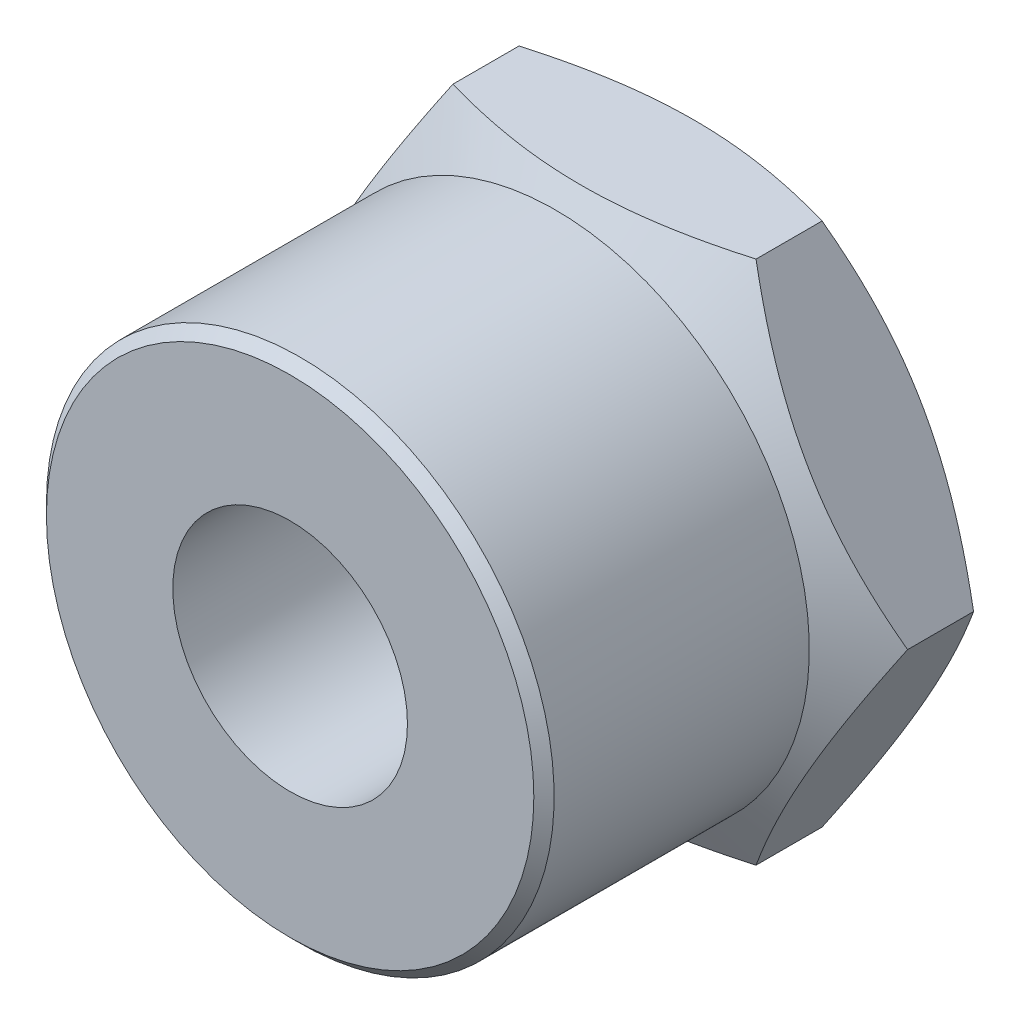
ISO-10303-21;
HEADER;
FILE_DESCRIPTION(('STEP AP214'),'2;1');
FILE_NAME('part.step','',(''),(''),'','','');
FILE_SCHEMA(('AUTOMOTIVE_DESIGN { 1 0 10303 214 1 1 1 1 }'));
ENDSEC;
DATA;
#1=APPLICATION_CONTEXT('core data for automotive mechanical design processes');
#2=APPLICATION_PROTOCOL_DEFINITION('international standard','automotive_design',2000,#1);
#3=PRODUCT_CONTEXT('',#1,'mechanical');
#4=PRODUCT('Part','Part','',(#3));
#5=PRODUCT_RELATED_PRODUCT_CATEGORY('part','',(#4));
#6=PRODUCT_DEFINITION_FORMATION('','',#4);
#7=PRODUCT_DEFINITION_CONTEXT('part definition',#1,'design');
#8=PRODUCT_DEFINITION('design','',#6,#7);
#9=PRODUCT_DEFINITION_SHAPE('','',#8);
#10=(LENGTH_UNIT() NAMED_UNIT(*) SI_UNIT(.MILLI.,.METRE.));
#11=(NAMED_UNIT(*) PLANE_ANGLE_UNIT() SI_UNIT($,.RADIAN.));
#12=(NAMED_UNIT(*) SI_UNIT($,.STERADIAN.) SOLID_ANGLE_UNIT());
#13=UNCERTAINTY_MEASURE_WITH_UNIT(LENGTH_MEASURE(1.E-05),#10,'distance_accuracy_value','');
#14=(GEOMETRIC_REPRESENTATION_CONTEXT(3) GLOBAL_UNCERTAINTY_ASSIGNED_CONTEXT((#13)) GLOBAL_UNIT_ASSIGNED_CONTEXT((#10,
#11,#12)) REPRESENTATION_CONTEXT('',''));
#15=CARTESIAN_POINT('',(0.,0.,0.));
#16=DIRECTION('',(0.,0.,1.));
#17=DIRECTION('',(1.,0.,0.));
#18=AXIS2_PLACEMENT_3D('',#15,#16,#17);
#19=CARTESIAN_POINT('',(1.58771324027147,-2.75,-1.72));
#20=DIRECTION('',(0.,0.,1.));
#21=DIRECTION('',(1.,0.,0.));
#22=AXIS2_PLACEMENT_3D('',#19,#20,#21);
#23=PLANE('',#22);
#24=CARTESIAN_POINT('',(0.,0.,-1.72));
#25=DIRECTION('',(0.,0.,-1.));
#26=DIRECTION('',(-1.,0.,0.));
#27=AXIS2_PLACEMENT_3D('',#24,#25,#26);
#28=CIRCLE('',#27,2.285);
#29=CARTESIAN_POINT('',(-2.285,0.,-1.72));
#30=VERTEX_POINT('',#29);
#31=EDGE_CURVE('E260',#30,#30,#28,.T.);
#32=ORIENTED_EDGE('',*,*,#31,.T.);
#33=EDGE_LOOP('',(#32));
#34=FACE_BOUND('',#33,.T.);
#35=CARTESIAN_POINT('',(0.,0.,-1.72));
#36=DIRECTION('',(0.,0.,-1.));
#37=DIRECTION('',(-1.,0.,0.));
#38=AXIS2_PLACEMENT_3D('',#35,#36,#37);
#39=CIRCLE('',#38,1.725);
#40=CARTESIAN_POINT('',(-1.725,0.,-1.72));
#41=VERTEX_POINT('',#40);
#42=EDGE_CURVE('E273',#41,#41,#39,.T.);
#43=ORIENTED_EDGE('',*,*,#42,.F.);
#44=EDGE_LOOP('',(#43));
#45=FACE_BOUND('',#44,.T.);
#46=ADVANCED_FACE('F37',(#34,#45),#23,.F.);
#47=CARTESIAN_POINT('',(0.,0.,-1.72));
#48=DIRECTION('',(0.,0.,1.));
#49=DIRECTION('',(1.,0.,0.));
#50=AXIS2_PLACEMENT_3D('',#47,#48,#49);
#51=CYLINDRICAL_SURFACE('',#50,1.2295);
#52=CARTESIAN_POINT('',(0.,0.,2.78));
#53=DIRECTION('',(0.,0.,1.));
#54=DIRECTION('',(1.,0.,0.));
#55=AXIS2_PLACEMENT_3D('',#52,#53,#54);
#56=CIRCLE('',#55,1.2295);
#57=CARTESIAN_POINT('',(1.2295,0.,2.78));
#58=VERTEX_POINT('',#57);
#59=EDGE_CURVE('E269',#58,#58,#56,.T.);
#60=ORIENTED_EDGE('',*,*,#59,.T.);
#61=EDGE_LOOP('',(#60));
#62=FACE_BOUND('',#61,.T.);
#63=CARTESIAN_POINT('',(0.,0.,-1.2245));
#64=DIRECTION('',(0.,0.,-1.));
#65=DIRECTION('',(-1.,0.,0.));
#66=AXIS2_PLACEMENT_3D('',#63,#64,#65);
#67=CIRCLE('',#66,1.2295);
#68=CARTESIAN_POINT('',(-1.2295,0.,-1.2245));
#69=VERTEX_POINT('',#68);
#70=EDGE_CURVE('E277',#69,#69,#67,.T.);
#71=ORIENTED_EDGE('',*,*,#70,.T.);
#72=EDGE_LOOP('',(#71));
#73=FACE_BOUND('',#72,.T.);
#74=ADVANCED_FACE('F142',(#62,#73),#51,.F.);
#75=CARTESIAN_POINT('',(-1.58771324027147,-2.75,-1.72));
#76=DIRECTION('',(0.,-1.,0.));
#77=DIRECTION('',(0.,0.,-1.));
#78=AXIS2_PLACEMENT_3D('',#75,#76,#77);
#79=PLANE('',#78);
#80=DIRECTION('',(0.,0.,1.));
#81=VECTOR('',#80,1.);
#82=CARTESIAN_POINT('',(1.58771324027147,-2.75,-1.72));
#83=LINE('',#82,#81);
#84=CARTESIAN_POINT('',(1.58771324027147,-2.75,-1.20591203176497));
#85=VERTEX_POINT('',#84);
#86=CARTESIAN_POINT('',(1.58771324027147,-2.75,-0.51408796823503));
#87=VERTEX_POINT('',#86);
#88=EDGE_CURVE('E123',#85,#87,#83,.T.);
#89=ORIENTED_EDGE('',*,*,#88,.T.);
#90=CARTESIAN_POINT('',(-4.17372684406499,-2.75,-1.56649519663326));
#91=CARTESIAN_POINT('',(-4.0543385393001,-2.75,-1.50895353087764));
#92=CARTESIAN_POINT('',(-3.93466614233989,-2.75,-1.45199067335123));
#93=CARTESIAN_POINT('',(-3.69460168800773,-2.75,-1.33955013709002));
#94=CARTESIAN_POINT('',(-3.57420951182439,-2.75,-1.2840727123215));
#95=CARTESIAN_POINT('',(-3.33188887394322,-2.75,-1.17463169777906));
#96=CARTESIAN_POINT('',(-3.20995554626624,-2.75,-1.12067884287359));
#97=CARTESIAN_POINT('',(-2.9650864516681,-2.75,-1.01510676567586));
#98=CARTESIAN_POINT('',(-2.84215073537795,-2.75,-0.963487426368249));
#99=CARTESIAN_POINT('',(-2.59150373483061,-2.75,-0.861749515549482));
#100=CARTESIAN_POINT('',(-2.46375713082373,-2.75,-0.811717461971101));
#101=CARTESIAN_POINT('',(-2.20673616561206,-2.75,-0.71566537092324));
#102=CARTESIAN_POINT('',(-2.07746163024061,-2.75,-0.669645795937771));
#103=CARTESIAN_POINT('',(-1.81745207460588,-2.75,-0.582893873341714));
#104=CARTESIAN_POINT('',(-1.6867209461336,-2.75,-0.542149983927988));
#105=CARTESIAN_POINT('',(-1.42338681719978,-2.75,-0.467316261676878));
#106=CARTESIAN_POINT('',(-1.29078444965124,-2.75,-0.433224234193583));
#107=CARTESIAN_POINT('',(-1.02433887064421,-2.75,-0.373561773278668));
#108=CARTESIAN_POINT('',(-0.890505221596048,-2.75,-0.347949446844723));
#109=CARTESIAN_POINT('',(-0.621273907465344,-2.75,-0.306758679336462));
#110=CARTESIAN_POINT('',(-0.485876362902075,-2.75,-0.291179470257582));
#111=CARTESIAN_POINT('',(-0.215921601291206,-2.75,-0.271502351990315));
#112=CARTESIAN_POINT('',(-0.0813748696181582,-2.75,-0.267264088732277));
#113=CARTESIAN_POINT('',(0.187599110045629,-2.75,-0.270263841263952));
#114=CARTESIAN_POINT('',(0.322026353083202,-2.75,-0.277502312457631));
#115=CARTESIAN_POINT('',(0.553032973989187,-2.75,-0.299305978692785));
#116=CARTESIAN_POINT('',(0.649866681902796,-2.75,-0.311312750750877));
#117=CARTESIAN_POINT('',(0.842761762143801,-2.75,-0.340482204376346));
#118=CARTESIAN_POINT('',(0.938823015235661,-2.75,-0.357645666815055));
#119=CARTESIAN_POINT('',(1.22574286825352,-2.75,-0.415964698210105));
#120=CARTESIAN_POINT('',(1.41521785730979,-2.75,-0.463936189477523));
#121=CARTESIAN_POINT('',(1.79428512096762,-2.75,-0.574115481863774));
#122=CARTESIAN_POINT('',(1.9837910889686,-2.75,-0.63660906585339));
#123=CARTESIAN_POINT('',(2.26544227808109,-2.75,-0.737399034746913));
#124=CARTESIAN_POINT('',(2.35887921292864,-2.75,-0.772165566470393));
#125=CARTESIAN_POINT('',(2.54499425117055,-2.75,-0.843673848490346));
#126=CARTESIAN_POINT('',(2.6376723618397,-2.75,-0.880415579825145));
#127=CARTESIAN_POINT('',(2.84931342346716,-2.75,-0.966501314174346));
#128=CARTESIAN_POINT('',(2.96805271430832,-2.75,-1.01639347447517));
#129=CARTESIAN_POINT('',(3.20459307067893,-2.75,-1.11835913672541));
#130=CARTESIAN_POINT('',(3.32239409339951,-2.75,-1.17043273753309));
#131=CARTESIAN_POINT('',(3.67465780532789,-2.75,-1.32927418148282));
#132=CARTESIAN_POINT('',(3.90794437704778,-2.75,-1.43864738128381));
#133=CARTESIAN_POINT('',(4.3724940002385,-2.75,-1.66207379455617));
#134=CARTESIAN_POINT('',(4.60375510751267,-2.75,-1.77613101008109));
#135=CARTESIAN_POINT('',(5.06467949382113,-2.75,-2.00743991307571));
#136=CARTESIAN_POINT('',(5.29434272202688,-2.75,-2.12469170158681));
#137=CARTESIAN_POINT('',(5.73454063268933,-2.75,-2.35220461856083));
#138=CARTESIAN_POINT('',(5.94516444342971,-2.75,-2.46229385483603));
#139=CARTESIAN_POINT('',(6.36564330009182,-2.75,-2.68394378312386));
#140=CARTESIAN_POINT('',(6.57549832375427,-2.75,-2.7955045173183));
#141=CARTESIAN_POINT('',(6.99415533064721,-2.75,-3.01951487842416));
#142=CARTESIAN_POINT('',(7.20295860617876,-2.75,-3.13196209355304));
#143=CARTESIAN_POINT('',(7.62006981796338,-2.75,-3.35774838003791));
#144=CARTESIAN_POINT('',(7.82837777721637,-2.75,-3.47108740888633));
#145=CARTESIAN_POINT('',(8.03650140351037,-2.75,-3.58476166346595));
#146=B_SPLINE_CURVE_WITH_KNOTS('',3,(#90,#91,#92,#93,#94,#95,#96,#97,#98,#99,#100,#101,#102,
#103,#104,#105,#106,#107,#108,#109,#110,#111,#112,#113,#114,#115,#116,#117,#118,#119,#120,#121,
#122,#123,#124,#125,#126,#127,#128,#129,#130,#131,#132,#133,#134,#135,#136,#137,#138,#139,#140,
#141,#142,#143,#144,#145),.UNSPECIFIED.,.F.,.F.,(4,2,2,2,2,2,2,2,2,2,2,2,2,2,2,2,2,2,2,2,2,2,2,
2,2,2,2,4),(0.,0.397599966461047,0.795267482546577,1.19525774136748,1.59522792017056,
2.00676015839095,2.41833976787196,2.82900316344548,3.23953083906245,3.64799898410124,
4.05643585843049,4.45979407402056,4.8631682955163,5.15575145410835,5.44837894056086,
6.03399339336628,6.63228890740999,6.9313576813945,7.23042358486796,7.61678155833849,
8.0031570597176,8.77602744416118,9.54957250280418,10.3231420564341,11.0361137043264,
11.7491058348068,12.4605728673644,13.1720061913926),.UNSPECIFIED.);
#147=CARTESIAN_POINT('',(-1.58771324027147,-2.75,-0.51408796823503));
#148=VERTEX_POINT('',#147);
#149=EDGE_CURVE('E52',#87,#148,#146,.F.);
#150=ORIENTED_EDGE('',*,*,#149,.T.);
#151=DIRECTION('',(0.,0.,1.));
#152=VECTOR('',#151,1.);
#153=CARTESIAN_POINT('',(-1.58771324027147,-2.75,-1.72));
#154=LINE('',#153,#152);
#155=CARTESIAN_POINT('',(-1.58771324027147,-2.75,-1.20591203176497));
#156=VERTEX_POINT('',#155);
#157=EDGE_CURVE('E106',#156,#148,#154,.T.);
#158=ORIENTED_EDGE('',*,*,#157,.F.);
#159=CARTESIAN_POINT('',(-4.17372684406499,-2.75,-0.153504803366739));
#160=CARTESIAN_POINT('',(-4.05433853930011,-2.75,-0.21104646912236));
#161=CARTESIAN_POINT('',(-3.93466614233989,-2.75,-0.268009326648769));
#162=CARTESIAN_POINT('',(-3.69460168800773,-2.75,-0.380449862909983));
#163=CARTESIAN_POINT('',(-3.57420951182439,-2.75,-0.435927287678496));
#164=CARTESIAN_POINT('',(-3.33188887394321,-2.75,-0.545368302220938));
#165=CARTESIAN_POINT('',(-3.20995554626624,-2.75,-0.599321157126408));
#166=CARTESIAN_POINT('',(-2.9650864516681,-2.75,-0.704893234324142));
#167=CARTESIAN_POINT('',(-2.84215073537795,-2.75,-0.75651257363175));
#168=CARTESIAN_POINT('',(-2.59150373483061,-2.75,-0.858250484450517));
#169=CARTESIAN_POINT('',(-2.46375713082373,-2.75,-0.908282538028898));
#170=CARTESIAN_POINT('',(-2.20673616561206,-2.75,-1.00433462907676));
#171=CARTESIAN_POINT('',(-2.07746163024061,-2.75,-1.05035420406223));
#172=CARTESIAN_POINT('',(-1.81745207460588,-2.75,-1.13710612665828));
#173=CARTESIAN_POINT('',(-1.6867209461336,-2.75,-1.17785001607201));
#174=CARTESIAN_POINT('',(-1.42338681719978,-2.75,-1.25268373832312));
#175=CARTESIAN_POINT('',(-1.29078444965124,-2.75,-1.28677576580642));
#176=CARTESIAN_POINT('',(-1.02433887064421,-2.75,-1.34643822672133));
#177=CARTESIAN_POINT('',(-0.890505221596048,-2.75,-1.37205055315528));
#178=CARTESIAN_POINT('',(-0.621273907465344,-2.75,-1.41324132066354));
#179=CARTESIAN_POINT('',(-0.485876362902075,-2.75,-1.42882052974242));
#180=CARTESIAN_POINT('',(-0.215921601291206,-2.75,-1.44849764800968));
#181=CARTESIAN_POINT('',(-0.0813748696181581,-2.75,-1.45273591126772));
#182=CARTESIAN_POINT('',(0.187599110045629,-2.75,-1.44973615873605));
#183=CARTESIAN_POINT('',(0.322026353083202,-2.75,-1.44249768754237));
#184=CARTESIAN_POINT('',(0.553032973989188,-2.75,-1.42069402130721));
#185=CARTESIAN_POINT('',(0.649866681902797,-2.75,-1.40868724924912));
#186=CARTESIAN_POINT('',(0.842761762143801,-2.75,-1.37951779562365));
#187=CARTESIAN_POINT('',(0.938823015235661,-2.75,-1.36235433318494));
#188=CARTESIAN_POINT('',(1.22574286825352,-2.75,-1.30403530178989));
#189=CARTESIAN_POINT('',(1.4152178573098,-2.75,-1.25606381052248));
#190=CARTESIAN_POINT('',(1.79428512096762,-2.75,-1.14588451813622));
#191=CARTESIAN_POINT('',(1.9837910889686,-2.75,-1.08339093414661));
#192=CARTESIAN_POINT('',(2.2654422780811,-2.75,-0.982600965253086));
#193=CARTESIAN_POINT('',(2.35887921292864,-2.75,-0.947834433529606));
#194=CARTESIAN_POINT('',(2.54499425117055,-2.75,-0.876326151509653));
#195=CARTESIAN_POINT('',(2.6376723618397,-2.75,-0.839584420174854));
#196=CARTESIAN_POINT('',(2.84931342346716,-2.75,-0.753498685825653));
#197=CARTESIAN_POINT('',(2.96805271430832,-2.75,-0.703606525524828));
#198=CARTESIAN_POINT('',(3.20459307067893,-2.75,-0.601640863274594));
#199=CARTESIAN_POINT('',(3.32239409339951,-2.75,-0.549567262466908));
#200=CARTESIAN_POINT('',(3.67465780532789,-2.75,-0.390725818517179));
#201=CARTESIAN_POINT('',(3.90794437704778,-2.75,-0.281352618716188));
#202=CARTESIAN_POINT('',(4.3724940002385,-2.75,-0.0579262054438312));
#203=CARTESIAN_POINT('',(4.60375510751267,-2.75,0.0561310100810888));
#204=CARTESIAN_POINT('',(5.06467949382113,-2.75,0.287439913075707));
#205=CARTESIAN_POINT('',(5.29434272202688,-2.75,0.40469170158681));
#206=CARTESIAN_POINT('',(5.73454063268933,-2.75,0.632204618560831));
#207=CARTESIAN_POINT('',(5.94516444342971,-2.75,0.742293854836033));
#208=CARTESIAN_POINT('',(6.36564330009182,-2.75,0.963943783123857));
#209=CARTESIAN_POINT('',(6.57549832375427,-2.75,1.0755045173183));
#210=CARTESIAN_POINT('',(6.99415533064721,-2.75,1.29951487842416));
#211=CARTESIAN_POINT('',(7.20295860617876,-2.75,1.41196209355304));
#212=CARTESIAN_POINT('',(7.62006981796339,-2.75,1.63774838003791));
#213=CARTESIAN_POINT('',(7.82837777721637,-2.75,1.75108740888633));
#214=CARTESIAN_POINT('',(8.03650140351038,-2.75,1.86476166346595));
#215=B_SPLINE_CURVE_WITH_KNOTS('',3,(#159,#160,#161,#162,#163,#164,#165,#166,#167,#168,#169,
#170,#171,#172,#173,#174,#175,#176,#177,#178,#179,#180,#181,#182,#183,#184,#185,#186,#187,#188,
#189,#190,#191,#192,#193,#194,#195,#196,#197,#198,#199,#200,#201,#202,#203,#204,#205,#206,#207,
#208,#209,#210,#211,#212,#213,#214),.UNSPECIFIED.,.F.,.F.,(4,2,2,2,2,2,2,2,2,2,2,2,2,2,2,2,2,2,
2,2,2,2,2,2,2,2,2,4),(0.,0.397599966461048,0.795267482546577,1.19525774136748,1.59522792017056,
2.00676015839095,2.41833976787196,2.82900316344548,3.23953083906245,3.64799898410124,
4.05643585843049,4.45979407402056,4.8631682955163,5.15575145410835,5.44837894056086,
6.03399339336628,6.63228890740999,6.9313576813945,7.23042358486796,7.61678155833849,
8.0031570597176,8.77602744416118,9.54957250280418,10.3231420564341,11.0361137043264,
11.7491058348068,12.4605728673644,13.1720061913927),.UNSPECIFIED.);
#216=EDGE_CURVE('E125',#156,#85,#215,.T.);
#217=ORIENTED_EDGE('',*,*,#216,.T.);
#218=EDGE_LOOP('',(#89,#150,#158,#217));
#219=FACE_BOUND('',#218,.T.);
#220=ADVANCED_FACE('F148',(#219),#79,.T.);
#221=CARTESIAN_POINT('',(-3.17542648054294,0.,-1.72));
#222=DIRECTION('',(-0.866025403784438,-0.5,0.));
#223=DIRECTION('',(0.5,-0.866025403784439,0.));
#224=AXIS2_PLACEMENT_3D('',#221,#222,#223);
#225=PLANE('',#224);
#226=ORIENTED_EDGE('',*,*,#157,.T.);
#227=CARTESIAN_POINT('',(-1.58759777021763,-2.7502,-0.514154638537927));
#228=CARTESIAN_POINT('',(-1.65737010029698,-2.62935077934009,-0.47385553742243));
#229=CARTESIAN_POINT('',(-1.72774469983533,-2.50745839737737,-0.43720477777083));
#230=CARTESIAN_POINT('',(-1.86971254687003,-2.26156287327211,-0.373230058142969));
#231=CARTESIAN_POINT('',(-1.94130831721583,-2.13755536142614,-0.345928730847666));
#232=CARTESIAN_POINT('',(-2.08361254889599,-1.89107720202406,-0.303429620467286));
#233=CARTESIAN_POINT('',(-2.15429911309864,-1.76864448141258,-0.287948993795627));
#234=CARTESIAN_POINT('',(-2.29600490065923,-1.52320285763109,-0.26946727254311));
#235=CARTESIAN_POINT('',(-2.36702360884403,-1.40019484676709,-0.266450874635769));
#236=CARTESIAN_POINT('',(-2.49972966594897,-1.17034121338921,-0.272721020601716));
#237=CARTESIAN_POINT('',(-2.56143686540072,-1.06346120874598,-0.280468029449872));
#238=CARTESIAN_POINT('',(-2.68444923614046,-0.850397532665251,-0.305023056237524));
#239=CARTESIAN_POINT('',(-2.74575398185008,-0.744214598351112,-0.321839464823739));
#240=CARTESIAN_POINT('',(-2.86902004703206,-0.530711510606817,-0.363879797519125));
#241=CARTESIAN_POINT('',(-2.93096576264318,-0.423418383857146,-0.389281955860399));
#242=CARTESIAN_POINT('',(-3.05393320806134,-0.210432520715949,-0.446935101013149));
#243=CARTESIAN_POINT('',(-3.11495651365995,-0.104737054973347,-0.47917253847215));
#244=CARTESIAN_POINT('',(-3.17554195059678,0.000200000000000299,-0.514154638537927));
#245=B_SPLINE_CURVE_WITH_KNOTS('',3,(#227,#228,#229,#230,#231,#232,#233,#234,#235,#236,#237,
#238,#239,#240,#241,#242,#243,#244),.UNSPECIFIED.,.F.,.F.,(4,2,2,2,2,2,2,2,4),(0.,
0.435912828725888,0.87287355711633,1.29901931904671,1.72464171213573,2.09526089052937,
2.46622354066374,2.84541551798557,3.22386274754524),.UNSPECIFIED.);
#246=CARTESIAN_POINT('',(-3.17542648054294,0.,-0.51408796823503));
#247=VERTEX_POINT('',#246);
#248=EDGE_CURVE('E91',#148,#247,#245,.T.);
#249=ORIENTED_EDGE('',*,*,#248,.T.);
#250=DIRECTION('',(0.,0.,1.));
#251=VECTOR('',#250,1.);
#252=CARTESIAN_POINT('',(-3.17542648054294,0.,-1.72));
#253=LINE('',#252,#251);
#254=CARTESIAN_POINT('',(-3.17542648054294,0.,-1.20591203176497));
#255=VERTEX_POINT('',#254);
#256=EDGE_CURVE('E104',#255,#247,#253,.T.);
#257=ORIENTED_EDGE('',*,*,#256,.F.);
#258=CARTESIAN_POINT('',(-3.17554195059678,0.000200000000000093,-1.20584536146207));
#259=CARTESIAN_POINT('',(-3.10576962051743,-0.120649220659906,-1.24614446257757));
#260=CARTESIAN_POINT('',(-3.03539502097908,-0.242541602622634,-1.28279522222917));
#261=CARTESIAN_POINT('',(-2.89342717394439,-0.488437126727892,-1.34676994185703));
#262=CARTESIAN_POINT('',(-2.82183140359858,-0.612444638573854,-1.37407126915233));
#263=CARTESIAN_POINT('',(-2.67952717191842,-0.858922797975942,-1.41657037953271));
#264=CARTESIAN_POINT('',(-2.60884060771577,-0.981355518587415,-1.43205100620437));
#265=CARTESIAN_POINT('',(-2.46713482015518,-1.22679714236891,-1.45053272745689));
#266=CARTESIAN_POINT('',(-2.39611611197038,-1.34980515323291,-1.45354912536423));
#267=CARTESIAN_POINT('',(-2.26341005486544,-1.57965878661079,-1.44727897939828));
#268=CARTESIAN_POINT('',(-2.20170285541369,-1.68653879125402,-1.43953197055013));
#269=CARTESIAN_POINT('',(-2.07869048467395,-1.89960246733475,-1.41497694376248));
#270=CARTESIAN_POINT('',(-2.01738573896433,-2.00578540164889,-1.39816053517626));
#271=CARTESIAN_POINT('',(-1.89411967378235,-2.21928848939318,-1.35612020248087));
#272=CARTESIAN_POINT('',(-1.83217395817123,-2.32658161614285,-1.3307180441396));
#273=CARTESIAN_POINT('',(-1.70920651275307,-2.53956747928405,-1.27306489898685));
#274=CARTESIAN_POINT('',(-1.64818320715446,-2.64526294502665,-1.24082746152785));
#275=CARTESIAN_POINT('',(-1.58759777021763,-2.7502,-1.20584536146207));
#276=B_SPLINE_CURVE_WITH_KNOTS('',3,(#258,#259,#260,#261,#262,#263,#264,#265,#266,#267,#268,
#269,#270,#271,#272,#273,#274,#275),.UNSPECIFIED.,.F.,.F.,(4,2,2,2,2,2,2,2,4),(0.,
0.435912828725887,0.87287355711633,1.29901931904671,1.72464171213573,2.09526089052937,
2.46622354066374,2.84541551798557,3.22386274754524),.UNSPECIFIED.);
#277=EDGE_CURVE('E162',#255,#156,#276,.T.);
#278=ORIENTED_EDGE('',*,*,#277,.T.);
#279=EDGE_LOOP('',(#226,#249,#257,#278));
#280=FACE_BOUND('',#279,.T.);
#281=ADVANCED_FACE('F102',(#280),#225,.T.);
#282=CARTESIAN_POINT('',(-1.58771324027147,2.75,-1.72));
#283=DIRECTION('',(-0.866025403784439,0.5,0.));
#284=DIRECTION('',(-0.5,-0.866025403784439,0.));
#285=AXIS2_PLACEMENT_3D('',#282,#283,#284);
#286=PLANE('',#285);
#287=ORIENTED_EDGE('',*,*,#256,.T.);
#288=CARTESIAN_POINT('',(-3.17554195059678,-0.000199999999999877,-0.514154638537927));
#289=CARTESIAN_POINT('',(-3.10576962051743,0.120649220659906,-0.47385553742243));
#290=CARTESIAN_POINT('',(-3.03539502097908,0.242541602622633,-0.43720477777083));
#291=CARTESIAN_POINT('',(-2.89342717394438,0.488437126727892,-0.373230058142969));
#292=CARTESIAN_POINT('',(-2.82183140359858,0.612444638573855,-0.345928730847666));
#293=CARTESIAN_POINT('',(-2.67952717191842,0.858922797975943,-0.303429620467286));
#294=CARTESIAN_POINT('',(-2.60884060771577,0.981355518587416,-0.287948993795627));
#295=CARTESIAN_POINT('',(-2.46713482015518,1.22679714236891,-0.26946727254311));
#296=CARTESIAN_POINT('',(-2.39611611197038,1.34980515323291,-0.266450874635769));
#297=CARTESIAN_POINT('',(-2.26341005486544,1.57965878661079,-0.272721020601716));
#298=CARTESIAN_POINT('',(-2.20170285541369,1.68653879125402,-0.280468029449872));
#299=CARTESIAN_POINT('',(-2.07869048467395,1.89960246733475,-0.305023056237524));
#300=CARTESIAN_POINT('',(-2.01738573896433,2.00578540164889,-0.321839464823739));
#301=CARTESIAN_POINT('',(-1.89411967378235,2.21928848939318,-0.363879797519125));
#302=CARTESIAN_POINT('',(-1.83217395817123,2.32658161614285,-0.389281955860399));
#303=CARTESIAN_POINT('',(-1.70920651275307,2.53956747928405,-0.44693510101315));
#304=CARTESIAN_POINT('',(-1.64818320715446,2.64526294502665,-0.47917253847215));
#305=CARTESIAN_POINT('',(-1.58759777021763,2.7502,-0.514154638537927));
#306=B_SPLINE_CURVE_WITH_KNOTS('',3,(#288,#289,#290,#291,#292,#293,#294,#295,#296,#297,#298,
#299,#300,#301,#302,#303,#304,#305),.UNSPECIFIED.,.F.,.F.,(4,2,2,2,2,2,2,2,4),(0.,
0.435912828725887,0.87287355711633,1.29901931904671,1.72464171213573,2.09526089052937,
2.46622354066374,2.84541551798557,3.22386274754524),.UNSPECIFIED.);
#307=CARTESIAN_POINT('',(-1.58771324027147,2.75,-0.51408796823503));
#308=VERTEX_POINT('',#307);
#309=EDGE_CURVE('E88',#247,#308,#306,.T.);
#310=ORIENTED_EDGE('',*,*,#309,.T.);
#311=DIRECTION('',(0.,0.,1.));
#312=VECTOR('',#311,1.);
#313=CARTESIAN_POINT('',(-1.58771324027147,2.75,-1.72));
#314=LINE('',#313,#312);
#315=CARTESIAN_POINT('',(-1.58771324027147,2.75,-1.20591203176497));
#316=VERTEX_POINT('',#315);
#317=EDGE_CURVE('E111',#316,#308,#314,.T.);
#318=ORIENTED_EDGE('',*,*,#317,.F.);
#319=CARTESIAN_POINT('',(-1.58759777021763,2.7502,-1.20584536146207));
#320=CARTESIAN_POINT('',(-1.65737010029698,2.62935077934009,-1.24614446257757));
#321=CARTESIAN_POINT('',(-1.72774469983533,2.50745839737737,-1.28279522222917));
#322=CARTESIAN_POINT('',(-1.86971254687003,2.26156287327211,-1.34676994185703));
#323=CARTESIAN_POINT('',(-1.94130831721583,2.13755536142615,-1.37407126915233));
#324=CARTESIAN_POINT('',(-2.08361254889599,1.89107720202406,-1.41657037953271));
#325=CARTESIAN_POINT('',(-2.15429911309864,1.76864448141258,-1.43205100620437));
#326=CARTESIAN_POINT('',(-2.29600490065923,1.52320285763109,-1.45053272745689));
#327=CARTESIAN_POINT('',(-2.36702360884403,1.40019484676709,-1.45354912536423));
#328=CARTESIAN_POINT('',(-2.49972966594897,1.17034121338921,-1.44727897939828));
#329=CARTESIAN_POINT('',(-2.56143686540072,1.06346120874598,-1.43953197055013));
#330=CARTESIAN_POINT('',(-2.68444923614046,0.850397532665252,-1.41497694376248));
#331=CARTESIAN_POINT('',(-2.74575398185008,0.744214598351112,-1.39816053517626));
#332=CARTESIAN_POINT('',(-2.86902004703206,0.530711510606817,-1.35612020248087));
#333=CARTESIAN_POINT('',(-2.93096576264318,0.423418383857146,-1.3307180441396));
#334=CARTESIAN_POINT('',(-3.05393320806134,0.210432520715949,-1.27306489898685));
#335=CARTESIAN_POINT('',(-3.11495651365995,0.104737054973348,-1.24082746152785));
#336=CARTESIAN_POINT('',(-3.17554195059678,-0.000199999999999999,-1.20584536146207));
#337=B_SPLINE_CURVE_WITH_KNOTS('',3,(#319,#320,#321,#322,#323,#324,#325,#326,#327,#328,#329,
#330,#331,#332,#333,#334,#335,#336),.UNSPECIFIED.,.F.,.F.,(4,2,2,2,2,2,2,2,4),(0.,
0.435912828725888,0.87287355711633,1.29901931904671,1.72464171213573,2.09526089052937,
2.46622354066374,2.84541551798557,3.22386274754524),.UNSPECIFIED.);
#338=EDGE_CURVE('E110',#316,#255,#337,.T.);
#339=ORIENTED_EDGE('',*,*,#338,.T.);
#340=EDGE_LOOP('',(#287,#310,#318,#339));
#341=FACE_BOUND('',#340,.T.);
#342=ADVANCED_FACE('F109',(#341),#286,.T.);
#343=CARTESIAN_POINT('',(1.58771324027147,2.75,-1.72));
#344=DIRECTION('',(0.,1.,0.));
#345=DIRECTION('',(-1.,0.,0.));
#346=AXIS2_PLACEMENT_3D('',#343,#344,#345);
#347=PLANE('',#346);
#348=ORIENTED_EDGE('',*,*,#317,.T.);
#349=CARTESIAN_POINT('',(-4.17372684406499,2.75,-1.56649519663326));
#350=CARTESIAN_POINT('',(-4.05433853930011,2.75,-1.50895353087764));
#351=CARTESIAN_POINT('',(-3.93466614233989,2.75,-1.45199067335123));
#352=CARTESIAN_POINT('',(-3.69460168800773,2.75,-1.33955013709002));
#353=CARTESIAN_POINT('',(-3.57420951182439,2.75,-1.2840727123215));
#354=CARTESIAN_POINT('',(-3.33188887394322,2.75,-1.17463169777906));
#355=CARTESIAN_POINT('',(-3.20995554626624,2.75,-1.12067884287359));
#356=CARTESIAN_POINT('',(-2.9650864516681,2.75,-1.01510676567586));
#357=CARTESIAN_POINT('',(-2.84215073537795,2.75,-0.96348742636825));
#358=CARTESIAN_POINT('',(-2.59150373483061,2.75,-0.861749515549483));
#359=CARTESIAN_POINT('',(-2.46375713082373,2.75,-0.811717461971101));
#360=CARTESIAN_POINT('',(-2.20673616561206,2.75,-0.715665370923241));
#361=CARTESIAN_POINT('',(-2.07746163024061,2.75,-0.669645795937772));
#362=CARTESIAN_POINT('',(-1.81745207460589,2.75,-0.582893873341715));
#363=CARTESIAN_POINT('',(-1.6867209461336,2.75,-0.542149983927989));
#364=CARTESIAN_POINT('',(-1.42338681719978,2.75,-0.467316261676878));
#365=CARTESIAN_POINT('',(-1.29078444965124,2.75,-0.433224234193583));
#366=CARTESIAN_POINT('',(-1.02433887064421,2.75,-0.373561773278668));
#367=CARTESIAN_POINT('',(-0.890505221596049,2.75,-0.347949446844724));
#368=CARTESIAN_POINT('',(-0.621273907465344,2.75,-0.306758679336463));
#369=CARTESIAN_POINT('',(-0.485876362902075,2.75,-0.291179470257583));
#370=CARTESIAN_POINT('',(-0.215921601291206,2.75,-0.271502351990316));
#371=CARTESIAN_POINT('',(-0.0813748696181588,2.75,-0.267264088732278));
#372=CARTESIAN_POINT('',(0.187599110045628,2.75,-0.270263841263952));
#373=CARTESIAN_POINT('',(0.322026353083202,2.75,-0.277502312457632));
#374=CARTESIAN_POINT('',(0.553032973989187,2.75,-0.299305978692786));
#375=CARTESIAN_POINT('',(0.649866681902797,2.75,-0.311312750750878));
#376=CARTESIAN_POINT('',(0.842761762143801,2.75,-0.340482204376347));
#377=CARTESIAN_POINT('',(0.938823015235661,2.75,-0.357645666815056));
#378=CARTESIAN_POINT('',(1.22574286825352,2.75,-0.415964698210106));
#379=CARTESIAN_POINT('',(1.4152178573098,2.75,-0.463936189477524));
#380=CARTESIAN_POINT('',(1.79428512096762,2.75,-0.574115481863775));
#381=CARTESIAN_POINT('',(1.9837910889686,2.75,-0.636609065853391));
#382=CARTESIAN_POINT('',(2.2654422780811,2.75,-0.737399034746914));
#383=CARTESIAN_POINT('',(2.35887921292864,2.75,-0.772165566470394));
#384=CARTESIAN_POINT('',(2.54499425117056,2.75,-0.843673848490348));
#385=CARTESIAN_POINT('',(2.6376723618397,2.75,-0.880415579825146));
#386=CARTESIAN_POINT('',(2.84931342346716,2.75,-0.966501314174347));
#387=CARTESIAN_POINT('',(2.96805271430832,2.75,-1.01639347447517));
#388=CARTESIAN_POINT('',(3.20459307067893,2.75,-1.11835913672541));
#389=CARTESIAN_POINT('',(3.32239409339952,2.75,-1.17043273753309));
#390=CARTESIAN_POINT('',(3.67465780532789,2.75,-1.32927418148282));
#391=CARTESIAN_POINT('',(3.90794437704778,2.75,-1.43864738128381));
#392=CARTESIAN_POINT('',(4.3724940002385,2.75,-1.66207379455617));
#393=CARTESIAN_POINT('',(4.60375510751267,2.75,-1.77613101008109));
#394=CARTESIAN_POINT('',(5.06467949382113,2.75,-2.00743991307571));
#395=CARTESIAN_POINT('',(5.29434272202688,2.75,-2.12469170158681));
#396=CARTESIAN_POINT('',(5.73454063268933,2.75,-2.35220461856083));
#397=CARTESIAN_POINT('',(5.94516444342971,2.75,-2.46229385483603));
#398=CARTESIAN_POINT('',(6.36564330009182,2.75,-2.68394378312386));
#399=CARTESIAN_POINT('',(6.57549832375428,2.75,-2.7955045173183));
#400=CARTESIAN_POINT('',(6.99415533064721,2.75,-3.01951487842416));
#401=CARTESIAN_POINT('',(7.20295860617876,2.75,-3.13196209355304));
#402=CARTESIAN_POINT('',(7.62006981796339,2.75,-3.35774838003791));
#403=CARTESIAN_POINT('',(7.82837777721637,2.75,-3.47108740888633));
#404=CARTESIAN_POINT('',(8.03650140351037,2.75,-3.58476166346595));
#405=B_SPLINE_CURVE_WITH_KNOTS('',3,(#349,#350,#351,#352,#353,#354,#355,#356,#357,#358,#359,
#360,#361,#362,#363,#364,#365,#366,#367,#368,#369,#370,#371,#372,#373,#374,#375,#376,#377,#378,
#379,#380,#381,#382,#383,#384,#385,#386,#387,#388,#389,#390,#391,#392,#393,#394,#395,#396,#397,
#398,#399,#400,#401,#402,#403,#404),.UNSPECIFIED.,.F.,.F.,(4,2,2,2,2,2,2,2,2,2,2,2,2,2,2,2,2,2,
2,2,2,2,2,2,2,2,2,4),(0.,0.397599966461048,0.795267482546577,1.19525774136748,1.59522792017056,
2.00676015839096,2.41833976787196,2.82900316344548,3.23953083906245,3.64799898410124,
4.05643585843049,4.45979407402056,4.8631682955163,5.15575145410835,5.44837894056086,
6.03399339336629,6.63228890740999,6.93135768139451,7.23042358486797,7.61678155833849,
8.00315705971761,8.77602744416119,9.54957250280419,10.3231420564341,11.0361137043264,
11.7491058348068,12.4605728673644,13.1720061913927),.UNSPECIFIED.);
#406=CARTESIAN_POINT('',(1.58771324027147,2.75,-0.51408796823503));
#407=VERTEX_POINT('',#406);
#408=EDGE_CURVE('E93',#308,#407,#405,.T.);
#409=ORIENTED_EDGE('',*,*,#408,.T.);
#410=DIRECTION('',(0.,0.,1.));
#411=VECTOR('',#410,1.);
#412=CARTESIAN_POINT('',(1.58771324027147,2.75,-1.72));
#413=LINE('',#412,#411);
#414=CARTESIAN_POINT('',(1.58771324027147,2.75,-1.20591203176497));
#415=VERTEX_POINT('',#414);
#416=EDGE_CURVE('E114',#415,#407,#413,.T.);
#417=ORIENTED_EDGE('',*,*,#416,.F.);
#418=CARTESIAN_POINT('',(-4.17372684406499,2.75,-0.153504803366738));
#419=CARTESIAN_POINT('',(-4.05433853930011,2.75,-0.211046469122358));
#420=CARTESIAN_POINT('',(-3.93466614233989,2.75,-0.268009326648768));
#421=CARTESIAN_POINT('',(-3.69460168800773,2.75,-0.380449862909982));
#422=CARTESIAN_POINT('',(-3.57420951182439,2.75,-0.435927287678496));
#423=CARTESIAN_POINT('',(-3.33188887394322,2.75,-0.545368302220938));
#424=CARTESIAN_POINT('',(-3.20995554626624,2.75,-0.599321157126407));
#425=CARTESIAN_POINT('',(-2.9650864516681,2.75,-0.70489323432414));
#426=CARTESIAN_POINT('',(-2.84215073537795,2.75,-0.756512573631749));
#427=CARTESIAN_POINT('',(-2.59150373483061,2.75,-0.858250484450516));
#428=CARTESIAN_POINT('',(-2.46375713082373,2.75,-0.908282538028898));
#429=CARTESIAN_POINT('',(-2.20673616561207,2.75,-1.00433462907676));
#430=CARTESIAN_POINT('',(-2.07746163024061,2.75,-1.05035420406223));
#431=CARTESIAN_POINT('',(-1.81745207460589,2.75,-1.13710612665828));
#432=CARTESIAN_POINT('',(-1.6867209461336,2.75,-1.17785001607201));
#433=CARTESIAN_POINT('',(-1.42338681719978,2.75,-1.25268373832312));
#434=CARTESIAN_POINT('',(-1.29078444965124,2.75,-1.28677576580642));
#435=CARTESIAN_POINT('',(-1.02433887064421,2.75,-1.34643822672133));
#436=CARTESIAN_POINT('',(-0.890505221596049,2.75,-1.37205055315528));
#437=CARTESIAN_POINT('',(-0.621273907465344,2.75,-1.41324132066354));
#438=CARTESIAN_POINT('',(-0.485876362902075,2.75,-1.42882052974242));
#439=CARTESIAN_POINT('',(-0.215921601291206,2.75,-1.44849764800968));
#440=CARTESIAN_POINT('',(-0.0813748696181583,2.75,-1.45273591126772));
#441=CARTESIAN_POINT('',(0.187599110045629,2.75,-1.44973615873605));
#442=CARTESIAN_POINT('',(0.322026353083202,2.75,-1.44249768754237));
#443=CARTESIAN_POINT('',(0.553032973989187,2.75,-1.42069402130721));
#444=CARTESIAN_POINT('',(0.649866681902797,2.75,-1.40868724924912));
#445=CARTESIAN_POINT('',(0.842761762143802,2.75,-1.37951779562365));
#446=CARTESIAN_POINT('',(0.938823015235661,2.75,-1.36235433318494));
#447=CARTESIAN_POINT('',(1.22574286825352,2.75,-1.30403530178989));
#448=CARTESIAN_POINT('',(1.4152178573098,2.75,-1.25606381052248));
#449=CARTESIAN_POINT('',(1.79428512096762,2.75,-1.14588451813622));
#450=CARTESIAN_POINT('',(1.9837910889686,2.75,-1.08339093414661));
#451=CARTESIAN_POINT('',(2.2654422780811,2.75,-0.982600965253085));
#452=CARTESIAN_POINT('',(2.35887921292864,2.75,-0.947834433529605));
#453=CARTESIAN_POINT('',(2.54499425117056,2.75,-0.876326151509652));
#454=CARTESIAN_POINT('',(2.6376723618397,2.75,-0.839584420174853));
#455=CARTESIAN_POINT('',(2.84931342346717,2.75,-0.753498685825652));
#456=CARTESIAN_POINT('',(2.96805271430832,2.75,-0.703606525524826));
#457=CARTESIAN_POINT('',(3.20459307067893,2.75,-0.601640863274592));
#458=CARTESIAN_POINT('',(3.32239409339952,2.75,-0.549567262466906));
#459=CARTESIAN_POINT('',(3.6746578053279,2.75,-0.390725818517178));
#460=CARTESIAN_POINT('',(3.90794437704778,2.75,-0.281352618716186));
#461=CARTESIAN_POINT('',(4.3724940002385,2.75,-0.0579262054438282));
#462=CARTESIAN_POINT('',(4.60375510751268,2.75,0.0561310100810919));
#463=CARTESIAN_POINT('',(5.06467949382114,2.75,0.28743991307571));
#464=CARTESIAN_POINT('',(5.29434272202689,2.75,0.404691701586813));
#465=CARTESIAN_POINT('',(5.73454063268934,2.75,0.632204618560834));
#466=CARTESIAN_POINT('',(5.94516444342971,2.75,0.742293854836035));
#467=CARTESIAN_POINT('',(6.36564330009182,2.75,0.963943783123859));
#468=CARTESIAN_POINT('',(6.57549832375428,2.75,1.0755045173183));
#469=CARTESIAN_POINT('',(6.99415533064721,2.75,1.29951487842417));
#470=CARTESIAN_POINT('',(7.20295860617877,2.75,1.41196209355304));
#471=CARTESIAN_POINT('',(7.62006981796339,2.75,1.63774838003792));
#472=CARTESIAN_POINT('',(7.82837777721637,2.75,1.75108740888633));
#473=CARTESIAN_POINT('',(8.03650140351038,2.75,1.86476166346595));
#474=B_SPLINE_CURVE_WITH_KNOTS('',3,(#418,#419,#420,#421,#422,#423,#424,#425,#426,#427,#428,
#429,#430,#431,#432,#433,#434,#435,#436,#437,#438,#439,#440,#441,#442,#443,#444,#445,#446,#447,
#448,#449,#450,#451,#452,#453,#454,#455,#456,#457,#458,#459,#460,#461,#462,#463,#464,#465,#466,
#467,#468,#469,#470,#471,#472,#473),.UNSPECIFIED.,.F.,.F.,(4,2,2,2,2,2,2,2,2,2,2,2,2,2,2,2,2,2,
2,2,2,2,2,2,2,2,2,4),(0.,0.397599966461048,0.795267482546578,1.19525774136748,1.59522792017056,
2.00676015839095,2.41833976787196,2.82900316344548,3.23953083906245,3.64799898410124,
4.05643585843049,4.45979407402057,4.8631682955163,5.15575145410835,5.44837894056086,
6.03399339336629,6.63228890740999,6.93135768139451,7.23042358486797,7.61678155833849,
8.00315705971761,8.77602744416119,9.54957250280419,10.3231420564341,11.0361137043264,
11.7491058348068,12.4605728673644,13.1720061913927),.UNSPECIFIED.);
#475=EDGE_CURVE('E224',#415,#316,#474,.F.);
#476=ORIENTED_EDGE('',*,*,#475,.T.);
#477=EDGE_LOOP('',(#348,#409,#417,#476));
#478=FACE_BOUND('',#477,.T.);
#479=ADVANCED_FACE('F216',(#478),#347,.T.);
#480=CARTESIAN_POINT('',(3.17542648054294,0.,-1.72));
#481=DIRECTION('',(0.866025403784438,0.5,0.));
#482=DIRECTION('',(-0.5,0.866025403784438,0.));
#483=AXIS2_PLACEMENT_3D('',#480,#481,#482);
#484=PLANE('',#483);
#485=ORIENTED_EDGE('',*,*,#416,.T.);
#486=CARTESIAN_POINT('',(1.58759777021763,2.7502,-0.514154638537928));
#487=CARTESIAN_POINT('',(1.65737010029698,2.6293507793401,-0.473855537422431));
#488=CARTESIAN_POINT('',(1.72774469983533,2.50745839737737,-0.43720477777083));
#489=CARTESIAN_POINT('',(1.86971254687003,2.26156287327211,-0.37323005814297));
#490=CARTESIAN_POINT('',(1.94130831721583,2.13755536142615,-0.345928730847667));
#491=CARTESIAN_POINT('',(2.08361254889599,1.89107720202406,-0.303429620467287));
#492=CARTESIAN_POINT('',(2.15429911309864,1.76864448141258,-0.287948993795628));
#493=CARTESIAN_POINT('',(2.29600490065923,1.52320285763109,-0.269467272543111));
#494=CARTESIAN_POINT('',(2.36702360884404,1.40019484676709,-0.26645087463577));
#495=CARTESIAN_POINT('',(2.49972966594897,1.17034121338921,-0.272721020601717));
#496=CARTESIAN_POINT('',(2.56143686540073,1.06346120874598,-0.280468029449872));
#497=CARTESIAN_POINT('',(2.68444923614047,0.850397532665252,-0.305023056237524));
#498=CARTESIAN_POINT('',(2.74575398185008,0.744214598351112,-0.32183946482374));
#499=CARTESIAN_POINT('',(2.86902004703206,0.530711510606817,-0.363879797519125));
#500=CARTESIAN_POINT('',(2.93096576264318,0.423418383857146,-0.3892819558604));
#501=CARTESIAN_POINT('',(3.05393320806134,0.210432520715949,-0.44693510101315));
#502=CARTESIAN_POINT('',(3.11495651365995,0.104737054973347,-0.479172538472151));
#503=CARTESIAN_POINT('',(3.17554195059678,-0.000200000000000406,-0.514154638537928));
#504=B_SPLINE_CURVE_WITH_KNOTS('',3,(#486,#487,#488,#489,#490,#491,#492,#493,#494,#495,#496,
#497,#498,#499,#500,#501,#502,#503),.UNSPECIFIED.,.F.,.F.,(4,2,2,2,2,2,2,2,4),(0.,
0.435912828725888,0.872873557116331,1.29901931904671,1.72464171213573,2.09526089052937,
2.46622354066374,2.84541551798557,3.22386274754524),.UNSPECIFIED.);
#505=CARTESIAN_POINT('',(3.17542648054294,0.,-0.51408796823503));
#506=VERTEX_POINT('',#505);
#507=EDGE_CURVE('E205',#407,#506,#504,.T.);
#508=ORIENTED_EDGE('',*,*,#507,.T.);
#509=DIRECTION('',(0.,0.,1.));
#510=VECTOR('',#509,1.);
#511=CARTESIAN_POINT('',(3.17542648054294,0.,-1.72));
#512=LINE('',#511,#510);
#513=CARTESIAN_POINT('',(3.17542648054294,0.,-1.20591203176497));
#514=VERTEX_POINT('',#513);
#515=EDGE_CURVE('E120',#514,#506,#512,.T.);
#516=ORIENTED_EDGE('',*,*,#515,.F.);
#517=CARTESIAN_POINT('',(3.17554195059678,-0.000200000000000068,-1.20584536146207));
#518=CARTESIAN_POINT('',(3.10576962051743,0.120649220659906,-1.24614446257757));
#519=CARTESIAN_POINT('',(3.03539502097908,0.242541602622634,-1.28279522222917));
#520=CARTESIAN_POINT('',(2.89342717394439,0.488437126727892,-1.34676994185703));
#521=CARTESIAN_POINT('',(2.82183140359858,0.612444638573855,-1.37407126915233));
#522=CARTESIAN_POINT('',(2.67952717191843,0.858922797975943,-1.41657037953271));
#523=CARTESIAN_POINT('',(2.60884060771577,0.981355518587416,-1.43205100620437));
#524=CARTESIAN_POINT('',(2.46713482015519,1.22679714236891,-1.45053272745689));
#525=CARTESIAN_POINT('',(2.39611611197038,1.34980515323291,-1.45354912536423));
#526=CARTESIAN_POINT('',(2.26341005486544,1.57965878661079,-1.44727897939828));
#527=CARTESIAN_POINT('',(2.20170285541369,1.68653879125402,-1.43953197055013));
#528=CARTESIAN_POINT('',(2.07869048467395,1.89960246733475,-1.41497694376247));
#529=CARTESIAN_POINT('',(2.01738573896433,2.00578540164889,-1.39816053517626));
#530=CARTESIAN_POINT('',(1.89411967378235,2.21928848939318,-1.35612020248087));
#531=CARTESIAN_POINT('',(1.83217395817123,2.32658161614285,-1.3307180441396));
#532=CARTESIAN_POINT('',(1.70920651275307,2.53956747928405,-1.27306489898685));
#533=CARTESIAN_POINT('',(1.64818320715446,2.64526294502665,-1.24082746152785));
#534=CARTESIAN_POINT('',(1.58759777021763,2.7502,-1.20584536146207));
#535=B_SPLINE_CURVE_WITH_KNOTS('',3,(#517,#518,#519,#520,#521,#522,#523,#524,#525,#526,#527,
#528,#529,#530,#531,#532,#533,#534),.UNSPECIFIED.,.F.,.F.,(4,2,2,2,2,2,2,2,4),(0.,
0.435912828725888,0.872873557116331,1.29901931904671,1.72464171213573,2.09526089052937,
2.46622354066374,2.84541551798557,3.22386274754524),.UNSPECIFIED.);
#536=EDGE_CURVE('E60',#514,#415,#535,.T.);
#537=ORIENTED_EDGE('',*,*,#536,.T.);
#538=EDGE_LOOP('',(#485,#508,#516,#537));
#539=FACE_BOUND('',#538,.T.);
#540=ADVANCED_FACE('F219',(#539),#484,.T.);
#541=CARTESIAN_POINT('',(1.58771324027147,-2.75,-1.72));
#542=DIRECTION('',(0.866025403784439,-0.5,0.));
#543=DIRECTION('',(0.5,0.866025403784439,0.));
#544=AXIS2_PLACEMENT_3D('',#541,#542,#543);
#545=PLANE('',#544);
#546=ORIENTED_EDGE('',*,*,#515,.T.);
#547=CARTESIAN_POINT('',(3.17554195059678,0.000199999999999971,-0.514154638537928));
#548=CARTESIAN_POINT('',(3.10576962051743,-0.120649220659906,-0.473855537422432));
#549=CARTESIAN_POINT('',(3.03539502097908,-0.242541602622634,-0.437204777770831));
#550=CARTESIAN_POINT('',(2.89342717394439,-0.488437126727892,-0.37323005814297));
#551=CARTESIAN_POINT('',(2.82183140359858,-0.612444638573855,-0.345928730847667));
#552=CARTESIAN_POINT('',(2.67952717191843,-0.858922797975943,-0.303429620467287));
#553=CARTESIAN_POINT('',(2.60884060771577,-0.981355518587416,-0.287948993795628));
#554=CARTESIAN_POINT('',(2.46713482015519,-1.22679714236891,-0.269467272543111));
#555=CARTESIAN_POINT('',(2.39611611197038,-1.34980515323291,-0.26645087463577));
#556=CARTESIAN_POINT('',(2.26341005486544,-1.57965878661079,-0.272721020601717));
#557=CARTESIAN_POINT('',(2.20170285541369,-1.68653879125402,-0.280468029449873));
#558=CARTESIAN_POINT('',(2.07869048467395,-1.89960246733475,-0.305023056237525));
#559=CARTESIAN_POINT('',(2.01738573896434,-2.00578540164889,-0.32183946482374));
#560=CARTESIAN_POINT('',(1.89411967378235,-2.21928848939318,-0.363879797519125));
#561=CARTESIAN_POINT('',(1.83217395817123,-2.32658161614285,-0.3892819558604));
#562=CARTESIAN_POINT('',(1.70920651275308,-2.53956747928405,-0.44693510101315));
#563=CARTESIAN_POINT('',(1.64818320715446,-2.64526294502665,-0.47917253847215));
#564=CARTESIAN_POINT('',(1.58759777021763,-2.7502,-0.514154638537928));
#565=B_SPLINE_CURVE_WITH_KNOTS('',3,(#547,#548,#549,#550,#551,#552,#553,#554,#555,#556,#557,
#558,#559,#560,#561,#562,#563,#564),.UNSPECIFIED.,.F.,.F.,(4,2,2,2,2,2,2,2,4),(0.,
0.435912828725887,0.872873557116331,1.29901931904671,1.72464171213573,2.09526089052937,
2.46622354066374,2.84541551798557,3.22386274754524),.UNSPECIFIED.);
#566=EDGE_CURVE('E195',#506,#87,#565,.T.);
#567=ORIENTED_EDGE('',*,*,#566,.T.);
#568=ORIENTED_EDGE('',*,*,#88,.F.);
#569=CARTESIAN_POINT('',(1.58759777021763,-2.7502,-1.20584536146207));
#570=CARTESIAN_POINT('',(1.65737010029699,-2.62935077934009,-1.24614446257757));
#571=CARTESIAN_POINT('',(1.72774469983533,-2.50745839737737,-1.28279522222917));
#572=CARTESIAN_POINT('',(1.86971254687003,-2.26156287327211,-1.34676994185703));
#573=CARTESIAN_POINT('',(1.94130831721583,-2.13755536142614,-1.37407126915233));
#574=CARTESIAN_POINT('',(2.08361254889599,-1.89107720202406,-1.41657037953271));
#575=CARTESIAN_POINT('',(2.15429911309864,-1.76864448141258,-1.43205100620437));
#576=CARTESIAN_POINT('',(2.29600490065923,-1.52320285763109,-1.45053272745689));
#577=CARTESIAN_POINT('',(2.36702360884404,-1.40019484676709,-1.45354912536423));
#578=CARTESIAN_POINT('',(2.49972966594897,-1.17034121338921,-1.44727897939828));
#579=CARTESIAN_POINT('',(2.56143686540073,-1.06346120874598,-1.43953197055013));
#580=CARTESIAN_POINT('',(2.68444923614047,-0.850397532665251,-1.41497694376247));
#581=CARTESIAN_POINT('',(2.74575398185008,-0.744214598351111,-1.39816053517626));
#582=CARTESIAN_POINT('',(2.86902004703206,-0.530711510606816,-1.35612020248087));
#583=CARTESIAN_POINT('',(2.93096576264318,-0.423418383857145,-1.3307180441396));
#584=CARTESIAN_POINT('',(3.05393320806134,-0.210432520715949,-1.27306489898685));
#585=CARTESIAN_POINT('',(3.11495651365995,-0.104737054973347,-1.24082746152785));
#586=CARTESIAN_POINT('',(3.17554195059678,0.000200000000000137,-1.20584536146207));
#587=B_SPLINE_CURVE_WITH_KNOTS('',3,(#569,#570,#571,#572,#573,#574,#575,#576,#577,#578,#579,
#580,#581,#582,#583,#584,#585,#586),.UNSPECIFIED.,.F.,.F.,(4,2,2,2,2,2,2,2,4),(0.,
0.435912828725887,0.872873557116331,1.29901931904671,1.72464171213573,2.09526089052937,
2.46622354066374,2.84541551798557,3.22386274754524),.UNSPECIFIED.);
#588=EDGE_CURVE('E255',#85,#514,#587,.T.);
#589=ORIENTED_EDGE('',*,*,#588,.T.);
#590=EDGE_LOOP('',(#546,#567,#568,#589));
#591=FACE_BOUND('',#590,.T.);
#592=ADVANCED_FACE('F249',(#591),#545,.T.);
#593=CARTESIAN_POINT('',(0.,0.,-1.72));
#594=DIRECTION('',(0.,0.,1.));
#595=DIRECTION('',(1.,0.,0.));
#596=AXIS2_PLACEMENT_3D('',#593,#594,#595);
#597=CONICAL_SURFACE('',#596,2.285,1.0471975511966);
#598=ORIENTED_EDGE('',*,*,#277,.F.);
#599=ORIENTED_EDGE('',*,*,#338,.F.);
#600=ORIENTED_EDGE('',*,*,#475,.F.);
#601=ORIENTED_EDGE('',*,*,#536,.F.);
#602=ORIENTED_EDGE('',*,*,#588,.F.);
#603=ORIENTED_EDGE('',*,*,#216,.F.);
#604=EDGE_LOOP('',(#598,#599,#600,#601,#602,#603));
#605=FACE_BOUND('',#604,.T.);
#606=ORIENTED_EDGE('',*,*,#31,.F.);
#607=EDGE_LOOP('',(#606));
#608=FACE_BOUND('',#607,.T.);
#609=ADVANCED_FACE('F188',(#605,#608),#597,.T.);
#610=CARTESIAN_POINT('',(0.,0.,-0.51408796823503));
#611=DIRECTION('',(0.,0.,-1.));
#612=DIRECTION('',(-1.,0.,0.));
#613=AXIS2_PLACEMENT_3D('',#610,#611,#612);
#614=CONICAL_SURFACE('',#613,3.17542648054294,1.0471975511966);
#615=CARTESIAN_POINT('',(0.,0.,5.6843418860808E-11));
#616=DIRECTION('',(0.,0.,1.));
#617=DIRECTION('',(1.,0.,0.));
#618=AXIS2_PLACEMENT_3D('',#615,#616,#617);
#619=CIRCLE('',#618,2.28499999990155);
#620=CARTESIAN_POINT('',(2.28499999990155,0.,5.6843418860808E-11));
#621=VERTEX_POINT('',#620);
#622=EDGE_CURVE('E264',#621,#621,#619,.F.);
#623=ORIENTED_EDGE('',*,*,#622,.T.);
#624=EDGE_LOOP('',(#623));
#625=FACE_BOUND('',#624,.T.);
#626=ORIENTED_EDGE('',*,*,#566,.F.);
#627=ORIENTED_EDGE('',*,*,#507,.F.);
#628=ORIENTED_EDGE('',*,*,#408,.F.);
#629=ORIENTED_EDGE('',*,*,#309,.F.);
#630=ORIENTED_EDGE('',*,*,#248,.F.);
#631=ORIENTED_EDGE('',*,*,#149,.F.);
#632=EDGE_LOOP('',(#626,#627,#628,#629,#630,#631));
#633=FACE_BOUND('',#632,.T.);
#634=ADVANCED_FACE('F90',(#625,#633),#614,.T.);
#635=CARTESIAN_POINT('',(0.,0.,14.8036161518249));
#636=DIRECTION('',(0.,0.,-1.));
#637=DIRECTION('',(-1.,0.,0.));
#638=AXIS2_PLACEMENT_3D('',#635,#636,#637);
#639=CYLINDRICAL_SURFACE('',#638,2.66);
#640=CARTESIAN_POINT('',(0.,0.,2.67360000000001));
#641=DIRECTION('',(0.,0.,1.));
#642=DIRECTION('',(1.,0.,0.));
#643=AXIS2_PLACEMENT_3D('',#640,#641,#642);
#644=CIRCLE('',#643,2.66);
#645=CARTESIAN_POINT('',(-2.66,0.,2.6736));
#646=VERTEX_POINT('',#645);
#647=EDGE_CURVE('E12',#646,#646,#644,.F.);
#648=CARTESIAN_POINT('',(0.,0.,5.6843418860808E-11));
#649=DIRECTION('',(0.,0.,1.));
#650=DIRECTION('',(1.,0.,0.));
#651=AXIS2_PLACEMENT_3D('',#648,#649,#650);
#652=CIRCLE('',#651,2.66);
#653=CARTESIAN_POINT('',(-2.66,0.,5.6841684137332E-11));
#654=VERTEX_POINT('',#653);
#655=EDGE_CURVE('E266',#654,#654,#652,.T.);
#656=CARTESIAN_POINT('',(-2.66,0.,2.6736));
#657=CARTESIAN_POINT('',(-2.66,0.,2.6457500000006));
#658=CARTESIAN_POINT('',(-2.66,0.,2.61790000000119));
#659=CARTESIAN_POINT('',(-2.66,0.,2.56220000000237));
#660=CARTESIAN_POINT('',(-2.66,0.,2.53435000000296));
#661=CARTESIAN_POINT('',(-2.66,0.,2.47865000000415));
#662=CARTESIAN_POINT('',(-2.66,0.,2.45080000000474));
#663=CARTESIAN_POINT('',(-2.66,0.,2.39510000000592));
#664=CARTESIAN_POINT('',(-2.66,0.,2.36725000000652));
#665=CARTESIAN_POINT('',(-2.66,0.,2.3115500000077));
#666=CARTESIAN_POINT('',(-2.66,0.,2.28370000000829));
#667=CARTESIAN_POINT('',(-2.66,0.,2.22800000000948));
#668=CARTESIAN_POINT('',(-2.66,0.,2.20015000001007));
#669=CARTESIAN_POINT('',(-2.66,0.,2.14445000001125));
#670=CARTESIAN_POINT('',(-2.66,0.,2.11660000001184));
#671=CARTESIAN_POINT('',(-2.66,0.,2.06090000001303));
#672=CARTESIAN_POINT('',(-2.66,0.,2.03305000001362));
#673=CARTESIAN_POINT('',(-2.66,0.,1.97735000001481));
#674=CARTESIAN_POINT('',(-2.66,0.,1.9495000000154));
#675=CARTESIAN_POINT('',(-2.66,0.,1.89380000001658));
#676=CARTESIAN_POINT('',(-2.66,0.,1.86595000001717));
#677=CARTESIAN_POINT('',(-2.66,0.,1.81025000001836));
#678=CARTESIAN_POINT('',(-2.66,0.,1.78240000001895));
#679=CARTESIAN_POINT('',(-2.66,0.,1.72670000002013));
#680=CARTESIAN_POINT('',(-2.66,0.,1.69885000002073));
#681=CARTESIAN_POINT('',(-2.66,0.,1.64315000002191));
#682=CARTESIAN_POINT('',(-2.66,0.,1.6153000000225));
#683=CARTESIAN_POINT('',(-2.66,0.,1.55960000002369));
#684=CARTESIAN_POINT('',(-2.66,0.,1.53175000002428));
#685=CARTESIAN_POINT('',(-2.66,0.,1.47605000002546));
#686=CARTESIAN_POINT('',(-2.66,0.,1.44820000002605));
#687=CARTESIAN_POINT('',(-2.66,0.,1.39250000002724));
#688=CARTESIAN_POINT('',(-2.66,0.,1.36465000002783));
#689=CARTESIAN_POINT('',(-2.66,0.,1.30895000002901));
#690=CARTESIAN_POINT('',(-2.66,0.,1.28110000002961));
#691=CARTESIAN_POINT('',(-2.66,0.,1.22540000003079));
#692=CARTESIAN_POINT('',(-2.66,0.,1.19755000003138));
#693=CARTESIAN_POINT('',(-2.66,0.,1.14185000003257));
#694=CARTESIAN_POINT('',(-2.66,0.,1.11400000003316));
#695=CARTESIAN_POINT('',(-2.66,0.,1.05830000003434));
#696=CARTESIAN_POINT('',(-2.66,0.,1.03045000003494));
#697=CARTESIAN_POINT('',(-2.66,0.,0.97475000003612));
#698=CARTESIAN_POINT('',(-2.66,0.,0.946900000036711));
#699=CARTESIAN_POINT('',(-2.66,0.,0.891200000037895));
#700=CARTESIAN_POINT('',(-2.66,0.,0.863350000038487));
#701=CARTESIAN_POINT('',(-2.66,0.,0.807650000039671));
#702=CARTESIAN_POINT('',(-2.66,0.,0.779800000040264));
#703=CARTESIAN_POINT('',(-2.66,0.,0.724100000041448));
#704=CARTESIAN_POINT('',(-2.66,0.,0.69625000004204));
#705=CARTESIAN_POINT('',(-2.66,0.,0.640550000043224));
#706=CARTESIAN_POINT('',(-2.66,0.,0.612700000043816));
#707=CARTESIAN_POINT('',(-2.66,0.,0.557000000045001));
#708=CARTESIAN_POINT('',(-2.66,0.,0.529150000045593));
#709=CARTESIAN_POINT('',(-2.66,0.,0.473450000046777));
#710=CARTESIAN_POINT('',(-2.66,0.,0.445600000047369));
#711=CARTESIAN_POINT('',(-2.66,0.,0.389900000048553));
#712=CARTESIAN_POINT('',(-2.66,0.,0.362050000049145));
#713=CARTESIAN_POINT('',(-2.66,0.,0.306350000050329));
#714=CARTESIAN_POINT('',(-2.66,0.,0.278500000050921));
#715=CARTESIAN_POINT('',(-2.66,0.,0.222800000052106));
#716=CARTESIAN_POINT('',(-2.66,0.,0.194950000052697));
#717=CARTESIAN_POINT('',(-2.66,0.,0.139250000053881));
#718=CARTESIAN_POINT('',(-2.66,0.,0.111400000054473));
#719=CARTESIAN_POINT('',(-2.66,0.,0.0557000000556574));
#720=CARTESIAN_POINT('',(-2.66,0.,0.0278500000562496));
#721=CARTESIAN_POINT('',(-2.66,0.,5.6841684137332E-11));
#722=B_SPLINE_CURVE_WITH_KNOTS('',3,(#656,#657,#658,#659,#660,#661,#662,#663,#664,#665,#666,
#667,#668,#669,#670,#671,#672,#673,#674,#675,#676,#677,#678,#679,#680,#681,#682,#683,#684,#685,
#686,#687,#688,#689,#690,#691,#692,#693,#694,#695,#696,#697,#698,#699,#700,#701,#702,#703,#704,
#705,#706,#707,#708,#709,#710,#711,#712,#713,#714,#715,#716,#717,#718,#719,#720,#721),
.UNSPECIFIED.,.F.,.F.,(4,2,2,2,2,2,2,2,2,2,2,2,2,2,2,2,2,2,2,2,2,2,2,2,2,2,2,2,2,2,2,2,4),(0.,
0.0835499999982236,0.167099999996447,0.250649999994671,0.334199999992894,0.41774999999112,
0.501299999989343,0.584849999987567,0.66839999998579,0.751949999984014,0.835499999982238,
0.919049999980461,1.00259999997869,1.08614999997691,1.16969999997513,1.25324999997336,
1.33679999997158,1.4203499999698,1.50389999996803,1.58744999996625,1.67099999996448,
1.7545499999627,1.83809999996092,1.92164999995915,2.00519999995737,2.08874999995559,
2.17229999995382,2.25584999995204,2.33939999995027,2.42294999994849,2.50649999994671,
2.59004999994494,2.67359999994316),.UNSPECIFIED.);
#723=EDGE_CURVE('BSEAM187',#646,#654,#722,.T.);
#724=ORIENTED_EDGE('',*,*,#647,.T.);
#725=ORIENTED_EDGE('',*,*,#655,.T.);
#726=ORIENTED_EDGE('',*,*,#723,.T.);
#727=ORIENTED_EDGE('',*,*,#723,.F.);
#728=EDGE_LOOP('',(#724,#726,#725,#727));
#729=FACE_BOUND('',#728,.T.);
#730=ADVANCED_FACE('F187',(#729),#639,.T.);
#731=CARTESIAN_POINT('',(0.,0.,5.6843418860808E-11));
#732=DIRECTION('',(0.,0.,1.));
#733=DIRECTION('',(1.,0.,0.));
#734=AXIS2_PLACEMENT_3D('',#731,#732,#733);
#735=PLANE('',#734);
#736=ORIENTED_EDGE('',*,*,#622,.F.);
#737=EDGE_LOOP('',(#736));
#738=FACE_BOUND('',#737,.T.);
#739=ORIENTED_EDGE('',*,*,#655,.F.);
#740=EDGE_LOOP('',(#739));
#741=FACE_BOUND('',#740,.T.);
#742=ADVANCED_FACE('F285',(#738,#741),#735,.F.);
#743=CARTESIAN_POINT('',(1.58771324027147,-2.75,2.78));
#744=DIRECTION('',(0.,0.,1.));
#745=DIRECTION('',(1.,0.,0.));
#746=AXIS2_PLACEMENT_3D('',#743,#744,#745);
#747=PLANE('',#746);
#748=CARTESIAN_POINT('',(0.,0.,2.78));
#749=DIRECTION('',(0.,0.,1.));
#750=DIRECTION('',(1.,0.,0.));
#751=AXIS2_PLACEMENT_3D('',#748,#749,#750);
#752=CIRCLE('',#751,2.55360000000001);
#753=CARTESIAN_POINT('',(2.55360000000001,0.,2.78));
#754=VERTEX_POINT('',#753);
#755=EDGE_CURVE('E45',#754,#754,#752,.T.);
#756=ORIENTED_EDGE('',*,*,#755,.T.);
#757=EDGE_LOOP('',(#756));
#758=FACE_BOUND('',#757,.T.);
#759=ORIENTED_EDGE('',*,*,#59,.F.);
#760=EDGE_LOOP('',(#759));
#761=FACE_BOUND('',#760,.T.);
#762=ADVANCED_FACE('F129',(#758,#761),#747,.T.);
#763=CARTESIAN_POINT('',(0.,0.,-1.2245));
#764=DIRECTION('',(0.,0.,-1.));
#765=DIRECTION('',(-1.,0.,0.));
#766=AXIS2_PLACEMENT_3D('',#763,#764,#765);
#767=CONICAL_SURFACE('',#766,1.2295,0.785398163397454);
#768=ORIENTED_EDGE('',*,*,#42,.T.);
#769=EDGE_LOOP('',(#768));
#770=FACE_BOUND('',#769,.T.);
#771=ORIENTED_EDGE('',*,*,#70,.F.);
#772=EDGE_LOOP('',(#771));
#773=FACE_BOUND('',#772,.T.);
#774=ADVANCED_FACE('F133',(#770,#773),#767,.F.);
#775=CARTESIAN_POINT('',(0.,0.,2.78));
#776=DIRECTION('',(0.,0.,-1.));
#777=DIRECTION('',(-1.,0.,0.));
#778=AXIS2_PLACEMENT_3D('',#775,#776,#777);
#779=CONICAL_SURFACE('',#778,2.55360000000001,0.78539816339744);
#780=ORIENTED_EDGE('',*,*,#647,.F.);
#781=EDGE_LOOP('',(#780));
#782=FACE_BOUND('',#781,.T.);
#783=ORIENTED_EDGE('',*,*,#755,.F.);
#784=EDGE_LOOP('',(#783));
#785=FACE_BOUND('',#784,.T.);
#786=ADVANCED_FACE('F39',(#782,#785),#779,.T.);
#787=CLOSED_SHELL('',(#46,#74,#220,#281,#342,#479,#540,#592,#609,#634,#730,#742,#762,#774,#786));
#788=MANIFOLD_SOLID_BREP('B2',#787);
#789=ADVANCED_BREP_SHAPE_REPRESENTATION('',(#18,#788),#14);
#790=SHAPE_DEFINITION_REPRESENTATION(#9,#789);
ENDSEC;
END-ISO-10303-21;
